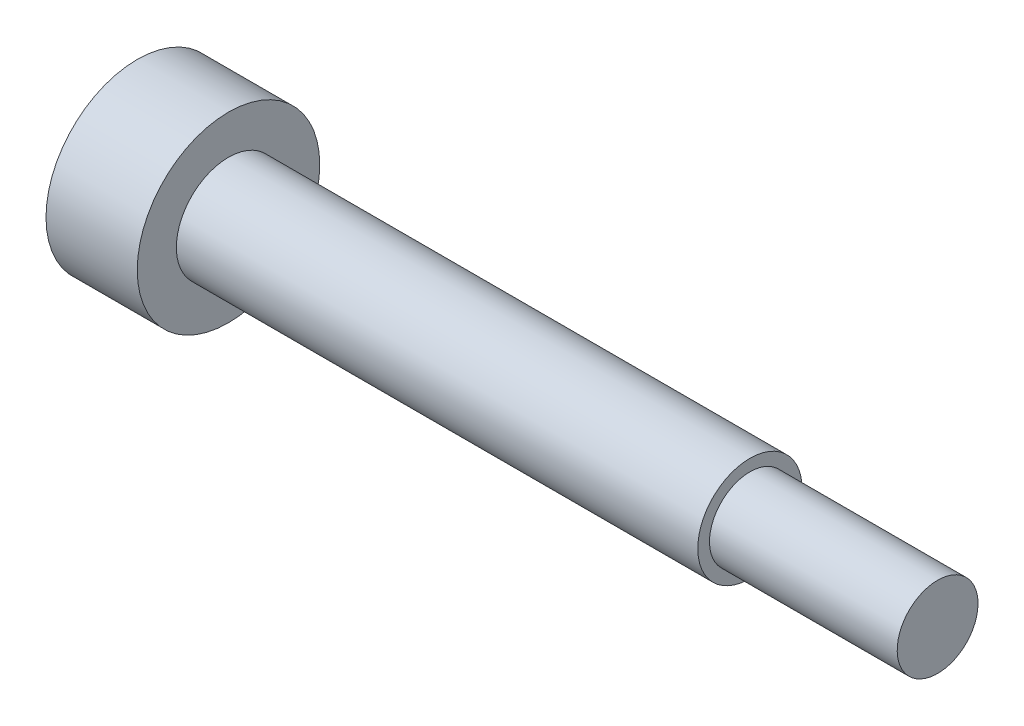
ISO-10303-21;
HEADER;
FILE_DESCRIPTION(('STEP AP214'),'2;1');
FILE_NAME('part.step','',(''),(''),'','','');
FILE_SCHEMA(('AUTOMOTIVE_DESIGN { 1 0 10303 214 1 1 1 1 }'));
ENDSEC;
DATA;
#1=APPLICATION_CONTEXT('core data for automotive mechanical design processes');
#2=APPLICATION_PROTOCOL_DEFINITION('international standard','automotive_design',2000,#1);
#3=PRODUCT_CONTEXT('',#1,'mechanical');
#4=PRODUCT('Part','Part','',(#3));
#5=PRODUCT_RELATED_PRODUCT_CATEGORY('part','',(#4));
#6=PRODUCT_DEFINITION_FORMATION('','',#4);
#7=PRODUCT_DEFINITION_CONTEXT('part definition',#1,'design');
#8=PRODUCT_DEFINITION('design','',#6,#7);
#9=PRODUCT_DEFINITION_SHAPE('','',#8);
#10=(LENGTH_UNIT() NAMED_UNIT(*) SI_UNIT(.MILLI.,.METRE.));
#11=(NAMED_UNIT(*) PLANE_ANGLE_UNIT() SI_UNIT($,.RADIAN.));
#12=(NAMED_UNIT(*) SI_UNIT($,.STERADIAN.) SOLID_ANGLE_UNIT());
#13=UNCERTAINTY_MEASURE_WITH_UNIT(LENGTH_MEASURE(1.E-05),#10,'distance_accuracy_value','');
#14=(GEOMETRIC_REPRESENTATION_CONTEXT(3) GLOBAL_UNCERTAINTY_ASSIGNED_CONTEXT((#13)) GLOBAL_UNIT_ASSIGNED_CONTEXT((#10,
#11,#12)) REPRESENTATION_CONTEXT('',''));
#15=CARTESIAN_POINT('',(0.,0.,0.));
#16=DIRECTION('',(0.,0.,1.));
#17=DIRECTION('',(1.,0.,0.));
#18=AXIS2_PLACEMENT_3D('',#15,#16,#17);
#19=CARTESIAN_POINT('',(0.,0.,0.));
#20=DIRECTION('',(-1.,0.,0.));
#21=DIRECTION('',(0.,-1.,0.));
#22=AXIS2_PLACEMENT_3D('',#19,#20,#21);
#23=PLANE('',#22);
#24=CARTESIAN_POINT('',(0.,0.,0.));
#25=DIRECTION('',(1.,0.,0.));
#26=DIRECTION('',(0.,1.,0.));
#27=AXIS2_PLACEMENT_3D('',#24,#25,#26);
#28=CIRCLE('',#27,3.5);
#29=CARTESIAN_POINT('',(0.,3.5,0.));
#30=VERTEX_POINT('',#29);
#31=EDGE_CURVE('E10',#30,#30,#28,.T.);
#32=ORIENTED_EDGE('',*,*,#31,.F.);
#33=EDGE_LOOP('',(#32));
#34=FACE_BOUND('',#33,.T.);
#35=ADVANCED_FACE('F43',(#34),#23,.T.);
#36=CARTESIAN_POINT('',(30.7,0.,0.));
#37=DIRECTION('',(1.,0.,0.));
#38=DIRECTION('',(0.,1.,0.));
#39=AXIS2_PLACEMENT_3D('',#36,#37,#38);
#40=CYLINDRICAL_SURFACE('',#39,3.5);
#41=ORIENTED_EDGE('',*,*,#31,.T.);
#42=EDGE_LOOP('',(#41));
#43=FACE_BOUND('',#42,.T.);
#44=CARTESIAN_POINT('',(3.5,0.,0.));
#45=DIRECTION('',(1.,0.,0.));
#46=DIRECTION('',(0.,1.,0.));
#47=AXIS2_PLACEMENT_3D('',#44,#45,#46);
#48=CIRCLE('',#47,3.5);
#49=CARTESIAN_POINT('',(3.5,3.5,0.));
#50=VERTEX_POINT('',#49);
#51=EDGE_CURVE('E50',#50,#50,#48,.T.);
#52=ORIENTED_EDGE('',*,*,#51,.F.);
#53=EDGE_LOOP('',(#52));
#54=FACE_BOUND('',#53,.T.);
#55=ADVANCED_FACE('F91',(#43,#54),#40,.T.);
#56=CARTESIAN_POINT('',(3.5,3.5,0.));
#57=DIRECTION('',(1.,0.,0.));
#58=DIRECTION('',(0.,1.,0.));
#59=AXIS2_PLACEMENT_3D('',#56,#57,#58);
#60=PLANE('',#59);
#61=ORIENTED_EDGE('',*,*,#51,.T.);
#62=EDGE_LOOP('',(#61));
#63=FACE_BOUND('',#62,.T.);
#64=CARTESIAN_POINT('',(3.5,0.,0.));
#65=DIRECTION('',(1.,0.,0.));
#66=DIRECTION('',(0.,1.,0.));
#67=AXIS2_PLACEMENT_3D('',#64,#65,#66);
#68=CIRCLE('',#67,2.);
#69=CARTESIAN_POINT('',(3.5,2.,0.));
#70=VERTEX_POINT('',#69);
#71=EDGE_CURVE('E55',#70,#70,#68,.T.);
#72=ORIENTED_EDGE('',*,*,#71,.F.);
#73=EDGE_LOOP('',(#72));
#74=FACE_BOUND('',#73,.T.);
#75=ADVANCED_FACE('F96',(#63,#74),#60,.T.);
#76=CARTESIAN_POINT('',(30.7,0.,0.));
#77=DIRECTION('',(1.,0.,0.));
#78=DIRECTION('',(0.,1.,0.));
#79=AXIS2_PLACEMENT_3D('',#76,#77,#78);
#80=CYLINDRICAL_SURFACE('',#79,2.);
#81=ORIENTED_EDGE('',*,*,#71,.T.);
#82=EDGE_LOOP('',(#81));
#83=FACE_BOUND('',#82,.T.);
#84=CARTESIAN_POINT('',(23.5,0.,0.));
#85=DIRECTION('',(1.,0.,0.));
#86=DIRECTION('',(0.,1.,0.));
#87=AXIS2_PLACEMENT_3D('',#84,#85,#86);
#88=CIRCLE('',#87,2.);
#89=CARTESIAN_POINT('',(23.5,2.,0.));
#90=VERTEX_POINT('',#89);
#91=EDGE_CURVE('E60',#90,#90,#88,.T.);
#92=ORIENTED_EDGE('',*,*,#91,.F.);
#93=EDGE_LOOP('',(#92));
#94=FACE_BOUND('',#93,.T.);
#95=ADVANCED_FACE('F87',(#83,#94),#80,.T.);
#96=CARTESIAN_POINT('',(23.5,2.,0.));
#97=DIRECTION('',(1.,0.,0.));
#98=DIRECTION('',(0.,1.,0.));
#99=AXIS2_PLACEMENT_3D('',#96,#97,#98);
#100=PLANE('',#99);
#101=ORIENTED_EDGE('',*,*,#91,.T.);
#102=EDGE_LOOP('',(#101));
#103=FACE_BOUND('',#102,.T.);
#104=CARTESIAN_POINT('',(23.5,0.,0.));
#105=DIRECTION('',(1.,0.,0.));
#106=DIRECTION('',(0.,1.,0.));
#107=AXIS2_PLACEMENT_3D('',#104,#105,#106);
#108=CIRCLE('',#107,1.55);
#109=CARTESIAN_POINT('',(23.5,1.55,0.));
#110=VERTEX_POINT('',#109);
#111=EDGE_CURVE('E66',#110,#110,#108,.T.);
#112=ORIENTED_EDGE('',*,*,#111,.F.);
#113=EDGE_LOOP('',(#112));
#114=FACE_BOUND('',#113,.T.);
#115=ADVANCED_FACE('F79',(#103,#114),#100,.T.);
#116=CARTESIAN_POINT('',(30.7,0.,0.));
#117=DIRECTION('',(1.,0.,0.));
#118=DIRECTION('',(0.,1.,0.));
#119=AXIS2_PLACEMENT_3D('',#116,#117,#118);
#120=CYLINDRICAL_SURFACE('',#119,1.55);
#121=ORIENTED_EDGE('',*,*,#111,.T.);
#122=EDGE_LOOP('',(#121));
#123=FACE_BOUND('',#122,.T.);
#124=CARTESIAN_POINT('',(30.7,0.,0.));
#125=DIRECTION('',(1.,0.,0.));
#126=DIRECTION('',(0.,1.,0.));
#127=AXIS2_PLACEMENT_3D('',#124,#125,#126);
#128=CIRCLE('',#127,1.55);
#129=CARTESIAN_POINT('',(30.7,1.55,0.));
#130=VERTEX_POINT('',#129);
#131=EDGE_CURVE('E70',#130,#130,#128,.T.);
#132=ORIENTED_EDGE('',*,*,#131,.F.);
#133=EDGE_LOOP('',(#132));
#134=FACE_BOUND('',#133,.T.);
#135=ADVANCED_FACE('F77',(#123,#134),#120,.T.);
#136=CARTESIAN_POINT('',(30.7,1.55,0.));
#137=DIRECTION('',(1.,0.,0.));
#138=DIRECTION('',(0.,1.,0.));
#139=AXIS2_PLACEMENT_3D('',#136,#137,#138);
#140=PLANE('',#139);
#141=ORIENTED_EDGE('',*,*,#131,.T.);
#142=EDGE_LOOP('',(#141));
#143=FACE_BOUND('',#142,.T.);
#144=ADVANCED_FACE('F75',(#143),#140,.T.);
#145=CLOSED_SHELL('',(#35,#55,#75,#95,#115,#135,#144));
#146=MANIFOLD_SOLID_BREP('B2',#145);
#147=ADVANCED_BREP_SHAPE_REPRESENTATION('',(#18,#146),#14);
#148=SHAPE_DEFINITION_REPRESENTATION(#9,#147);
ENDSEC;
END-ISO-10303-21;
